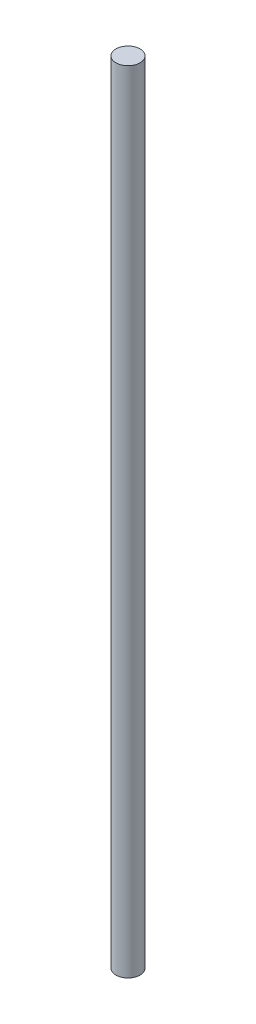
ISO-10303-21;
HEADER;
FILE_DESCRIPTION(('STEP AP214'),'2;1');
FILE_NAME('part.step','',(''),(''),'','','');
FILE_SCHEMA(('AUTOMOTIVE_DESIGN { 1 0 10303 214 1 1 1 1 }'));
ENDSEC;
DATA;
#1=APPLICATION_CONTEXT('core data for automotive mechanical design processes');
#2=APPLICATION_PROTOCOL_DEFINITION('international standard','automotive_design',2000,#1);
#3=PRODUCT_CONTEXT('',#1,'mechanical');
#4=PRODUCT('Part','Part','',(#3));
#5=PRODUCT_RELATED_PRODUCT_CATEGORY('part','',(#4));
#6=PRODUCT_DEFINITION_FORMATION('','',#4);
#7=PRODUCT_DEFINITION_CONTEXT('part definition',#1,'design');
#8=PRODUCT_DEFINITION('design','',#6,#7);
#9=PRODUCT_DEFINITION_SHAPE('','',#8);
#10=(LENGTH_UNIT() NAMED_UNIT(*) SI_UNIT(.MILLI.,.METRE.));
#11=(NAMED_UNIT(*) PLANE_ANGLE_UNIT() SI_UNIT($,.RADIAN.));
#12=(NAMED_UNIT(*) SI_UNIT($,.STERADIAN.) SOLID_ANGLE_UNIT());
#13=UNCERTAINTY_MEASURE_WITH_UNIT(LENGTH_MEASURE(1.E-05),#10,'distance_accuracy_value','');
#14=(GEOMETRIC_REPRESENTATION_CONTEXT(3) GLOBAL_UNCERTAINTY_ASSIGNED_CONTEXT((#13)) GLOBAL_UNIT_ASSIGNED_CONTEXT((#10,
#11,#12)) REPRESENTATION_CONTEXT('',''));
#15=CARTESIAN_POINT('',(0.,0.,0.));
#16=DIRECTION('',(0.,0.,1.));
#17=DIRECTION('',(1.,0.,0.));
#18=AXIS2_PLACEMENT_3D('',#15,#16,#17);
#19=CARTESIAN_POINT('',(0.,36.,0.));
#20=DIRECTION('',(0.,-1.,0.));
#21=DIRECTION('',(0.,0.,-1.));
#22=AXIS2_PLACEMENT_3D('',#19,#20,#21);
#23=CYLINDRICAL_SURFACE('',#22,0.55);
#24=CARTESIAN_POINT('',(0.,36.,0.));
#25=DIRECTION('',(0.,1.,0.));
#26=DIRECTION('',(0.,0.,1.));
#27=AXIS2_PLACEMENT_3D('',#24,#25,#26);
#28=CIRCLE('',#27,0.55);
#29=CARTESIAN_POINT('',(0.,36.,0.55));
#30=VERTEX_POINT('',#29);
#31=EDGE_CURVE('E10',#30,#30,#28,.T.);
#32=ORIENTED_EDGE('',*,*,#31,.F.);
#33=EDGE_LOOP('',(#32));
#34=FACE_BOUND('',#33,.T.);
#35=CARTESIAN_POINT('',(0.,0.,0.));
#36=DIRECTION('',(0.,1.,0.));
#37=DIRECTION('',(0.,0.,1.));
#38=AXIS2_PLACEMENT_3D('',#35,#36,#37);
#39=CIRCLE('',#38,0.55);
#40=CARTESIAN_POINT('',(0.,0.,0.55));
#41=VERTEX_POINT('',#40);
#42=EDGE_CURVE('E32',#41,#41,#39,.T.);
#43=ORIENTED_EDGE('',*,*,#42,.T.);
#44=EDGE_LOOP('',(#43));
#45=FACE_BOUND('',#44,.T.);
#46=ADVANCED_FACE('F29',(#34,#45),#23,.T.);
#47=CARTESIAN_POINT('',(0.,36.,0.));
#48=DIRECTION('',(0.,1.,0.));
#49=DIRECTION('',(0.,0.,1.));
#50=AXIS2_PLACEMENT_3D('',#47,#48,#49);
#51=PLANE('',#50);
#52=ORIENTED_EDGE('',*,*,#31,.T.);
#53=EDGE_LOOP('',(#52));
#54=FACE_BOUND('',#53,.T.);
#55=ADVANCED_FACE('F44',(#54),#51,.T.);
#56=CARTESIAN_POINT('',(0.,0.,0.));
#57=DIRECTION('',(0.,1.,0.));
#58=DIRECTION('',(0.,0.,1.));
#59=AXIS2_PLACEMENT_3D('',#56,#57,#58);
#60=PLANE('',#59);
#61=ORIENTED_EDGE('',*,*,#42,.F.);
#62=EDGE_LOOP('',(#61));
#63=FACE_BOUND('',#62,.T.);
#64=ADVANCED_FACE('F42',(#63),#60,.F.);
#65=CLOSED_SHELL('',(#46,#55,#64));
#66=MANIFOLD_SOLID_BREP('B2',#65);
#67=ADVANCED_BREP_SHAPE_REPRESENTATION('',(#18,#66),#14);
#68=SHAPE_DEFINITION_REPRESENTATION(#9,#67);
ENDSEC;
END-ISO-10303-21;
